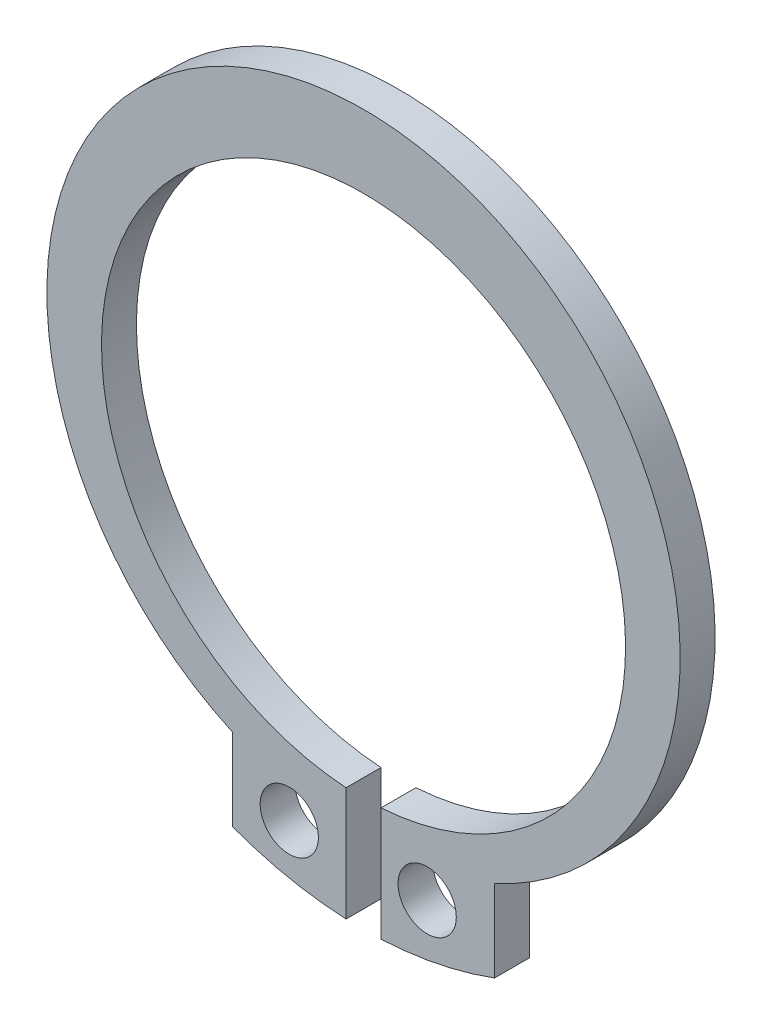
ISO-10303-21;
HEADER;
FILE_DESCRIPTION(('STEP AP214'),'2;1');
FILE_NAME('part.step','',(''),(''),'','','');
FILE_SCHEMA(('AUTOMOTIVE_DESIGN { 1 0 10303 214 1 1 1 1 }'));
ENDSEC;
DATA;
#1=APPLICATION_CONTEXT('core data for automotive mechanical design processes');
#2=APPLICATION_PROTOCOL_DEFINITION('international standard','automotive_design',2000,#1);
#3=PRODUCT_CONTEXT('',#1,'mechanical');
#4=PRODUCT('Part','Part','',(#3));
#5=PRODUCT_RELATED_PRODUCT_CATEGORY('part','',(#4));
#6=PRODUCT_DEFINITION_FORMATION('','',#4);
#7=PRODUCT_DEFINITION_CONTEXT('part definition',#1,'design');
#8=PRODUCT_DEFINITION('design','',#6,#7);
#9=PRODUCT_DEFINITION_SHAPE('','',#8);
#10=(LENGTH_UNIT() NAMED_UNIT(*) SI_UNIT(.MILLI.,.METRE.));
#11=(NAMED_UNIT(*) PLANE_ANGLE_UNIT() SI_UNIT($,.RADIAN.));
#12=(NAMED_UNIT(*) SI_UNIT($,.STERADIAN.) SOLID_ANGLE_UNIT());
#13=UNCERTAINTY_MEASURE_WITH_UNIT(LENGTH_MEASURE(1.E-05),#10,'distance_accuracy_value','');
#14=(GEOMETRIC_REPRESENTATION_CONTEXT(3) GLOBAL_UNCERTAINTY_ASSIGNED_CONTEXT((#13)) GLOBAL_UNIT_ASSIGNED_CONTEXT((#10,
#11,#12)) REPRESENTATION_CONTEXT('',''));
#15=CARTESIAN_POINT('',(0.,0.,0.));
#16=DIRECTION('',(0.,0.,1.));
#17=DIRECTION('',(1.,0.,0.));
#18=AXIS2_PLACEMENT_3D('',#15,#16,#17);
#19=CARTESIAN_POINT('',(0.181395348837212,2.34080448625151,0.));
#20=DIRECTION('',(0.,0.,1.));
#21=DIRECTION('',(1.,0.,0.));
#22=AXIS2_PLACEMENT_3D('',#19,#20,#21);
#23=PLANE('',#22);
#24=CARTESIAN_POINT('',(0.181395348837212,3.89577921954263,0.));
#25=DIRECTION('',(0.,0.,1.));
#26=DIRECTION('',(1.,0.,0.));
#27=AXIS2_PLACEMENT_3D('',#24,#25,#26);
#28=CIRCLE('',#27,9.);
#29=CARTESIAN_POINT('',(0.781395348837217,-5.08419850871482,0.));
#30=VERTEX_POINT('',#29);
#31=CARTESIAN_POINT('',(-0.418604651162787,-5.08419850871482,0.));
#32=VERTEX_POINT('',#31);
#33=EDGE_CURVE('E9',#30,#32,#28,.T.);
#34=ORIENTED_EDGE('',*,*,#33,.T.);
#35=DIRECTION('',(0.,1.,0.));
#36=VECTOR('',#35,1.);
#37=CARTESIAN_POINT('',(-0.418604651162788,-8.99025973740608,0.));
#38=LINE('',#37,#36);
#39=CARTESIAN_POINT('',(-0.41860465116279,-8.99025973740608,0.));
#40=VERTEX_POINT('',#39);
#41=EDGE_CURVE('E110',#40,#32,#38,.T.);
#42=ORIENTED_EDGE('',*,*,#41,.F.);
#43=CARTESIAN_POINT('',(0.181395348837212,3.89577921954263,0.));
#44=DIRECTION('',(0.,0.,1.));
#45=DIRECTION('',(1.,0.,0.));
#46=AXIS2_PLACEMENT_3D('',#43,#44,#45);
#47=CIRCLE('',#46,12.9);
#48=CARTESIAN_POINT('',(-4.31860465116279,-8.1938857882233,0.));
#49=VERTEX_POINT('',#48);
#50=EDGE_CURVE('E101',#49,#40,#47,.T.);
#51=ORIENTED_EDGE('',*,*,#50,.F.);
#52=DIRECTION('',(0.,1.,0.));
#53=VECTOR('',#52,1.);
#54=CARTESIAN_POINT('',(-4.31860465116279,-8.1938857882233,0.));
#55=LINE('',#54,#53);
#56=CARTESIAN_POINT('',(-4.31860465116279,-5.37950486729043,0.));
#57=VERTEX_POINT('',#56);
#58=EDGE_CURVE('E130',#49,#57,#55,.T.);
#59=ORIENTED_EDGE('',*,*,#58,.T.);
#60=CARTESIAN_POINT('',(0.181395348837212,4.52077921954264,0.));
#61=DIRECTION('',(0.,0.,1.));
#62=DIRECTION('',(1.,0.,0.));
#63=AXIS2_PLACEMENT_3D('',#60,#61,#62);
#64=CIRCLE('',#63,10.875);
#65=CARTESIAN_POINT('',(4.68139534883721,-5.37950486729043,0.));
#66=VERTEX_POINT('',#65);
#67=EDGE_CURVE('E114',#66,#57,#64,.T.);
#68=ORIENTED_EDGE('',*,*,#67,.F.);
#69=DIRECTION('',(0.,1.,0.));
#70=VECTOR('',#69,1.);
#71=CARTESIAN_POINT('',(4.68139534883721,-8.1938857882233,0.));
#72=LINE('',#71,#70);
#73=CARTESIAN_POINT('',(4.68139534883721,-8.1938857882233,0.));
#74=VERTEX_POINT('',#73);
#75=EDGE_CURVE('E142',#74,#66,#72,.T.);
#76=ORIENTED_EDGE('',*,*,#75,.F.);
#77=CARTESIAN_POINT('',(0.181395348837212,3.89577921954263,0.));
#78=DIRECTION('',(0.,0.,1.));
#79=DIRECTION('',(1.,0.,0.));
#80=AXIS2_PLACEMENT_3D('',#77,#78,#79);
#81=CIRCLE('',#80,12.9);
#82=CARTESIAN_POINT('',(0.781395348837217,-8.99025973740608,0.));
#83=VERTEX_POINT('',#82);
#84=EDGE_CURVE('E150',#83,#74,#81,.T.);
#85=ORIENTED_EDGE('',*,*,#84,.F.);
#86=DIRECTION('',(0.,1.,0.));
#87=VECTOR('',#86,1.);
#88=CARTESIAN_POINT('',(0.781395348837217,-8.99025973740608,0.));
#89=LINE('',#88,#87);
#90=EDGE_CURVE('E157',#83,#30,#89,.T.);
#91=ORIENTED_EDGE('',*,*,#90,.T.);
#92=EDGE_LOOP('',(#34,#42,#51,#59,#68,#76,#85,#91));
#93=FACE_BOUND('',#92,.T.);
#94=CARTESIAN_POINT('',(-2.36860465116279,-7.04025973740608,0.));
#95=DIRECTION('',(0.,0.,1.));
#96=DIRECTION('',(1.,0.,0.));
#97=AXIS2_PLACEMENT_3D('',#94,#95,#96);
#98=CIRCLE('',#97,1.);
#99=CARTESIAN_POINT('',(-1.36860465116279,-7.04025973740608,0.));
#100=VERTEX_POINT('',#99);
#101=EDGE_CURVE('E92',#100,#100,#98,.T.);
#102=ORIENTED_EDGE('',*,*,#101,.T.);
#103=EDGE_LOOP('',(#102));
#104=FACE_BOUND('',#103,.T.);
#105=CARTESIAN_POINT('',(2.3671096345515,-7.04025973740608,0.));
#106=DIRECTION('',(0.,0.,1.));
#107=DIRECTION('',(1.,0.,0.));
#108=AXIS2_PLACEMENT_3D('',#105,#106,#107);
#109=CIRCLE('',#108,1.);
#110=CARTESIAN_POINT('',(3.3671096345515,-7.04025973740608,0.));
#111=VERTEX_POINT('',#110);
#112=EDGE_CURVE('E102',#111,#111,#109,.T.);
#113=ORIENTED_EDGE('',*,*,#112,.T.);
#114=EDGE_LOOP('',(#113));
#115=FACE_BOUND('',#114,.T.);
#116=ADVANCED_FACE('F15',(#93,#104,#115),#23,.F.);
#117=CARTESIAN_POINT('',(0.181395348837212,2.34080448625151,1.2));
#118=DIRECTION('',(0.,0.,1.));
#119=DIRECTION('',(1.,0.,0.));
#120=AXIS2_PLACEMENT_3D('',#117,#118,#119);
#121=PLANE('',#120);
#122=DIRECTION('',(0.,-1.,0.));
#123=VECTOR('',#122,1.);
#124=CARTESIAN_POINT('',(-0.418604651162788,-8.99025973740608,1.2));
#125=LINE('',#124,#123);
#126=CARTESIAN_POINT('',(-0.418604651162787,-5.08419850871482,1.2));
#127=VERTEX_POINT('',#126);
#128=CARTESIAN_POINT('',(-0.41860465116279,-8.99025973740608,1.2));
#129=VERTEX_POINT('',#128);
#130=EDGE_CURVE('E91',#127,#129,#125,.T.);
#131=ORIENTED_EDGE('',*,*,#130,.F.);
#132=CARTESIAN_POINT('',(0.181395348837212,3.89577921954263,1.2));
#133=DIRECTION('',(0.,0.,1.));
#134=DIRECTION('',(1.,0.,0.));
#135=AXIS2_PLACEMENT_3D('',#132,#133,#134);
#136=CIRCLE('',#135,9.);
#137=CARTESIAN_POINT('',(0.781395348837217,-5.08419850871482,1.2));
#138=VERTEX_POINT('',#137);
#139=EDGE_CURVE('E23',#138,#127,#136,.T.);
#140=ORIENTED_EDGE('',*,*,#139,.F.);
#141=DIRECTION('',(0.,1.,0.));
#142=VECTOR('',#141,1.);
#143=CARTESIAN_POINT('',(0.781395348837217,-8.99025973740608,1.2));
#144=LINE('',#143,#142);
#145=CARTESIAN_POINT('',(0.781395348837217,-8.99025973740608,1.2));
#146=VERTEX_POINT('',#145);
#147=EDGE_CURVE('E152',#146,#138,#144,.T.);
#148=ORIENTED_EDGE('',*,*,#147,.F.);
#149=CARTESIAN_POINT('',(0.181395348837212,3.89577921954263,1.2));
#150=DIRECTION('',(0.,0.,-1.));
#151=DIRECTION('',(1.,0.,0.));
#152=AXIS2_PLACEMENT_3D('',#149,#150,#151);
#153=CIRCLE('',#152,12.9);
#154=CARTESIAN_POINT('',(4.68139534883721,-8.1938857882233,1.2));
#155=VERTEX_POINT('',#154);
#156=EDGE_CURVE('E144',#155,#146,#153,.T.);
#157=ORIENTED_EDGE('',*,*,#156,.F.);
#158=DIRECTION('',(0.,-1.,0.));
#159=VECTOR('',#158,1.);
#160=CARTESIAN_POINT('',(4.68139534883721,-8.1938857882233,1.2));
#161=LINE('',#160,#159);
#162=CARTESIAN_POINT('',(4.68139534883721,-5.37950486729043,1.2));
#163=VERTEX_POINT('',#162);
#164=EDGE_CURVE('E136',#163,#155,#161,.T.);
#165=ORIENTED_EDGE('',*,*,#164,.F.);
#166=CARTESIAN_POINT('',(0.181395348837212,4.52077921954264,1.2));
#167=DIRECTION('',(0.,0.,-1.));
#168=DIRECTION('',(1.,0.,0.));
#169=AXIS2_PLACEMENT_3D('',#166,#167,#168);
#170=CIRCLE('',#169,10.875);
#171=CARTESIAN_POINT('',(-4.31860465116279,-5.37950486729043,1.2));
#172=VERTEX_POINT('',#171);
#173=EDGE_CURVE('E115',#172,#163,#170,.T.);
#174=ORIENTED_EDGE('',*,*,#173,.F.);
#175=DIRECTION('',(0.,1.,0.));
#176=VECTOR('',#175,1.);
#177=CARTESIAN_POINT('',(-4.31860465116279,-8.1938857882233,1.2));
#178=LINE('',#177,#176);
#179=CARTESIAN_POINT('',(-4.31860465116279,-8.1938857882233,1.2));
#180=VERTEX_POINT('',#179);
#181=EDGE_CURVE('E104',#180,#172,#178,.T.);
#182=ORIENTED_EDGE('',*,*,#181,.F.);
#183=CARTESIAN_POINT('',(0.181395348837212,3.89577921954263,1.2));
#184=DIRECTION('',(0.,0.,-1.));
#185=DIRECTION('',(1.,0.,0.));
#186=AXIS2_PLACEMENT_3D('',#183,#184,#185);
#187=CIRCLE('',#186,12.9);
#188=EDGE_CURVE('E122',#129,#180,#187,.T.);
#189=ORIENTED_EDGE('',*,*,#188,.F.);
#190=EDGE_LOOP('',(#131,#140,#148,#157,#165,#174,#182,#189));
#191=FACE_BOUND('',#190,.T.);
#192=CARTESIAN_POINT('',(-2.36860465116279,-7.04025973740608,1.2));
#193=DIRECTION('',(0.,0.,-1.));
#194=DIRECTION('',(1.,0.,0.));
#195=AXIS2_PLACEMENT_3D('',#192,#193,#194);
#196=CIRCLE('',#195,1.);
#197=CARTESIAN_POINT('',(-1.36860465116279,-7.04025973740608,1.2));
#198=VERTEX_POINT('',#197);
#199=EDGE_CURVE('E88',#198,#198,#196,.T.);
#200=ORIENTED_EDGE('',*,*,#199,.T.);
#201=EDGE_LOOP('',(#200));
#202=FACE_BOUND('',#201,.T.);
#203=CARTESIAN_POINT('',(2.3671096345515,-7.04025973740608,1.2));
#204=DIRECTION('',(0.,0.,-1.));
#205=DIRECTION('',(1.,0.,0.));
#206=AXIS2_PLACEMENT_3D('',#203,#204,#205);
#207=CIRCLE('',#206,1.);
#208=CARTESIAN_POINT('',(3.3671096345515,-7.04025973740608,1.2));
#209=VERTEX_POINT('',#208);
#210=EDGE_CURVE('E97',#209,#209,#207,.T.);
#211=ORIENTED_EDGE('',*,*,#210,.T.);
#212=EDGE_LOOP('',(#211));
#213=FACE_BOUND('',#212,.T.);
#214=ADVANCED_FACE('F17',(#191,#202,#213),#121,.T.);
#215=CARTESIAN_POINT('',(0.181395348837212,3.89577921954263,0.));
#216=DIRECTION('',(0.,0.,-1.));
#217=DIRECTION('',(1.,0.,0.));
#218=AXIS2_PLACEMENT_3D('',#215,#216,#217);
#219=CYLINDRICAL_SURFACE('',#218,9.);
#220=ORIENTED_EDGE('',*,*,#139,.T.);
#221=DIRECTION('',(0.,0.,1.));
#222=VECTOR('',#221,1.);
#223=CARTESIAN_POINT('',(-0.418604651162787,-5.08419850871482,0.));
#224=LINE('',#223,#222);
#225=EDGE_CURVE('E119',#32,#127,#224,.T.);
#226=ORIENTED_EDGE('',*,*,#225,.F.);
#227=ORIENTED_EDGE('',*,*,#33,.F.);
#228=DIRECTION('',(0.,0.,1.));
#229=VECTOR('',#228,1.);
#230=CARTESIAN_POINT('',(0.781395348837217,-5.08419850871482,0.));
#231=LINE('',#230,#229);
#232=EDGE_CURVE('E155',#30,#138,#231,.T.);
#233=ORIENTED_EDGE('',*,*,#232,.T.);
#234=EDGE_LOOP('',(#220,#226,#227,#233));
#235=FACE_BOUND('',#234,.T.);
#236=ADVANCED_FACE('F158',(#235),#219,.F.);
#237=CARTESIAN_POINT('',(0.781395348837218,-7.03722912306045,0.));
#238=DIRECTION('',(-1.,0.,0.));
#239=DIRECTION('',(0.,-1.,0.));
#240=AXIS2_PLACEMENT_3D('',#237,#238,#239);
#241=PLANE('',#240);
#242=ORIENTED_EDGE('',*,*,#147,.T.);
#243=ORIENTED_EDGE('',*,*,#232,.F.);
#244=ORIENTED_EDGE('',*,*,#90,.F.);
#245=DIRECTION('',(0.,0.,1.));
#246=VECTOR('',#245,1.);
#247=CARTESIAN_POINT('',(0.781395348837217,-8.99025973740608,0.));
#248=LINE('',#247,#246);
#249=EDGE_CURVE('E147',#83,#146,#248,.T.);
#250=ORIENTED_EDGE('',*,*,#249,.T.);
#251=EDGE_LOOP('',(#242,#243,#244,#250));
#252=FACE_BOUND('',#251,.T.);
#253=ADVANCED_FACE('F174',(#252),#241,.T.);
#254=CARTESIAN_POINT('',(0.181395348837212,3.89577921954263,0.));
#255=DIRECTION('',(0.,0.,-1.));
#256=DIRECTION('',(1.,0.,0.));
#257=AXIS2_PLACEMENT_3D('',#254,#255,#256);
#258=CYLINDRICAL_SURFACE('',#257,12.9);
#259=ORIENTED_EDGE('',*,*,#156,.T.);
#260=ORIENTED_EDGE('',*,*,#249,.F.);
#261=ORIENTED_EDGE('',*,*,#84,.T.);
#262=DIRECTION('',(0.,0.,1.));
#263=VECTOR('',#262,1.);
#264=CARTESIAN_POINT('',(4.68139534883721,-8.1938857882233,0.));
#265=LINE('',#264,#263);
#266=EDGE_CURVE('E139',#74,#155,#265,.T.);
#267=ORIENTED_EDGE('',*,*,#266,.T.);
#268=EDGE_LOOP('',(#259,#260,#261,#267));
#269=FACE_BOUND('',#268,.T.);
#270=ADVANCED_FACE('F177',(#269),#258,.T.);
#271=CARTESIAN_POINT('',(4.68139534883721,-6.78669532775686,0.));
#272=DIRECTION('',(1.,0.,0.));
#273=DIRECTION('',(0.,1.,0.));
#274=AXIS2_PLACEMENT_3D('',#271,#272,#273);
#275=PLANE('',#274);
#276=ORIENTED_EDGE('',*,*,#164,.T.);
#277=ORIENTED_EDGE('',*,*,#266,.F.);
#278=ORIENTED_EDGE('',*,*,#75,.T.);
#279=DIRECTION('',(0.,0.,1.));
#280=VECTOR('',#279,1.);
#281=CARTESIAN_POINT('',(4.68139534883721,-5.37950486729043,0.));
#282=LINE('',#281,#280);
#283=EDGE_CURVE('E112',#66,#163,#282,.T.);
#284=ORIENTED_EDGE('',*,*,#283,.T.);
#285=EDGE_LOOP('',(#276,#277,#278,#284));
#286=FACE_BOUND('',#285,.T.);
#287=ADVANCED_FACE('F179',(#286),#275,.T.);
#288=CARTESIAN_POINT('',(0.181395348837212,4.52077921954264,0.));
#289=DIRECTION('',(0.,0.,-1.));
#290=DIRECTION('',(1.,0.,0.));
#291=AXIS2_PLACEMENT_3D('',#288,#289,#290);
#292=CYLINDRICAL_SURFACE('',#291,10.875);
#293=ORIENTED_EDGE('',*,*,#173,.T.);
#294=ORIENTED_EDGE('',*,*,#283,.F.);
#295=ORIENTED_EDGE('',*,*,#67,.T.);
#296=DIRECTION('',(0.,0.,1.));
#297=VECTOR('',#296,1.);
#298=CARTESIAN_POINT('',(-4.31860465116279,-5.37950486729043,0.));
#299=LINE('',#298,#297);
#300=EDGE_CURVE('E107',#57,#172,#299,.T.);
#301=ORIENTED_EDGE('',*,*,#300,.T.);
#302=EDGE_LOOP('',(#293,#294,#295,#301));
#303=FACE_BOUND('',#302,.T.);
#304=ADVANCED_FACE('F183',(#303),#292,.T.);
#305=CARTESIAN_POINT('',(-4.31860465116279,-6.78669532775686,0.));
#306=DIRECTION('',(-1.,0.,0.));
#307=DIRECTION('',(0.,-1.,0.));
#308=AXIS2_PLACEMENT_3D('',#305,#306,#307);
#309=PLANE('',#308);
#310=ORIENTED_EDGE('',*,*,#181,.T.);
#311=ORIENTED_EDGE('',*,*,#300,.F.);
#312=ORIENTED_EDGE('',*,*,#58,.F.);
#313=DIRECTION('',(0.,0.,1.));
#314=VECTOR('',#313,1.);
#315=CARTESIAN_POINT('',(-4.31860465116279,-8.1938857882233,0.));
#316=LINE('',#315,#314);
#317=EDGE_CURVE('E125',#49,#180,#316,.T.);
#318=ORIENTED_EDGE('',*,*,#317,.T.);
#319=EDGE_LOOP('',(#310,#311,#312,#318));
#320=FACE_BOUND('',#319,.T.);
#321=ADVANCED_FACE('F186',(#320),#309,.T.);
#322=CARTESIAN_POINT('',(0.181395348837212,3.89577921954263,0.));
#323=DIRECTION('',(0.,0.,-1.));
#324=DIRECTION('',(1.,0.,0.));
#325=AXIS2_PLACEMENT_3D('',#322,#323,#324);
#326=CYLINDRICAL_SURFACE('',#325,12.9);
#327=ORIENTED_EDGE('',*,*,#188,.T.);
#328=ORIENTED_EDGE('',*,*,#317,.F.);
#329=ORIENTED_EDGE('',*,*,#50,.T.);
#330=DIRECTION('',(0.,0.,1.));
#331=VECTOR('',#330,1.);
#332=CARTESIAN_POINT('',(-0.41860465116279,-8.99025973740608,0.));
#333=LINE('',#332,#331);
#334=EDGE_CURVE('E95',#40,#129,#333,.T.);
#335=ORIENTED_EDGE('',*,*,#334,.T.);
#336=EDGE_LOOP('',(#327,#328,#329,#335));
#337=FACE_BOUND('',#336,.T.);
#338=ADVANCED_FACE('F166',(#337),#326,.T.);
#339=CARTESIAN_POINT('',(-0.418604651162788,-7.03722912306045,0.));
#340=DIRECTION('',(1.,0.,0.));
#341=DIRECTION('',(0.,1.,0.));
#342=AXIS2_PLACEMENT_3D('',#339,#340,#341);
#343=PLANE('',#342);
#344=ORIENTED_EDGE('',*,*,#130,.T.);
#345=ORIENTED_EDGE('',*,*,#334,.F.);
#346=ORIENTED_EDGE('',*,*,#41,.T.);
#347=ORIENTED_EDGE('',*,*,#225,.T.);
#348=EDGE_LOOP('',(#344,#345,#346,#347));
#349=FACE_BOUND('',#348,.T.);
#350=ADVANCED_FACE('F161',(#349),#343,.T.);
#351=CARTESIAN_POINT('',(-2.36860465116279,-7.04025973740608,0.6));
#352=DIRECTION('',(0.,0.,-1.));
#353=DIRECTION('',(1.,0.,0.));
#354=AXIS2_PLACEMENT_3D('',#351,#352,#353);
#355=CYLINDRICAL_SURFACE('',#354,1.);
#356=ORIENTED_EDGE('',*,*,#199,.F.);
#357=EDGE_LOOP('',(#356));
#358=FACE_BOUND('',#357,.T.);
#359=ORIENTED_EDGE('',*,*,#101,.F.);
#360=EDGE_LOOP('',(#359));
#361=FACE_BOUND('',#360,.T.);
#362=ADVANCED_FACE('F214',(#358,#361),#355,.F.);
#363=CARTESIAN_POINT('',(2.3671096345515,-7.04025973740608,0.6));
#364=DIRECTION('',(0.,0.,-1.));
#365=DIRECTION('',(1.,0.,0.));
#366=AXIS2_PLACEMENT_3D('',#363,#364,#365);
#367=CYLINDRICAL_SURFACE('',#366,1.);
#368=ORIENTED_EDGE('',*,*,#210,.F.);
#369=EDGE_LOOP('',(#368));
#370=FACE_BOUND('',#369,.T.);
#371=ORIENTED_EDGE('',*,*,#112,.F.);
#372=EDGE_LOOP('',(#371));
#373=FACE_BOUND('',#372,.T.);
#374=ADVANCED_FACE('F220',(#370,#373),#367,.F.);
#375=CLOSED_SHELL('',(#116,#214,#236,#253,#270,#287,#304,#321,#338,#350,#362,#374));
#376=MANIFOLD_SOLID_BREP('B1',#375);
#377=ADVANCED_BREP_SHAPE_REPRESENTATION('',(#18,#376),#14);
#378=SHAPE_DEFINITION_REPRESENTATION(#9,#377);
ENDSEC;
END-ISO-10303-21;
